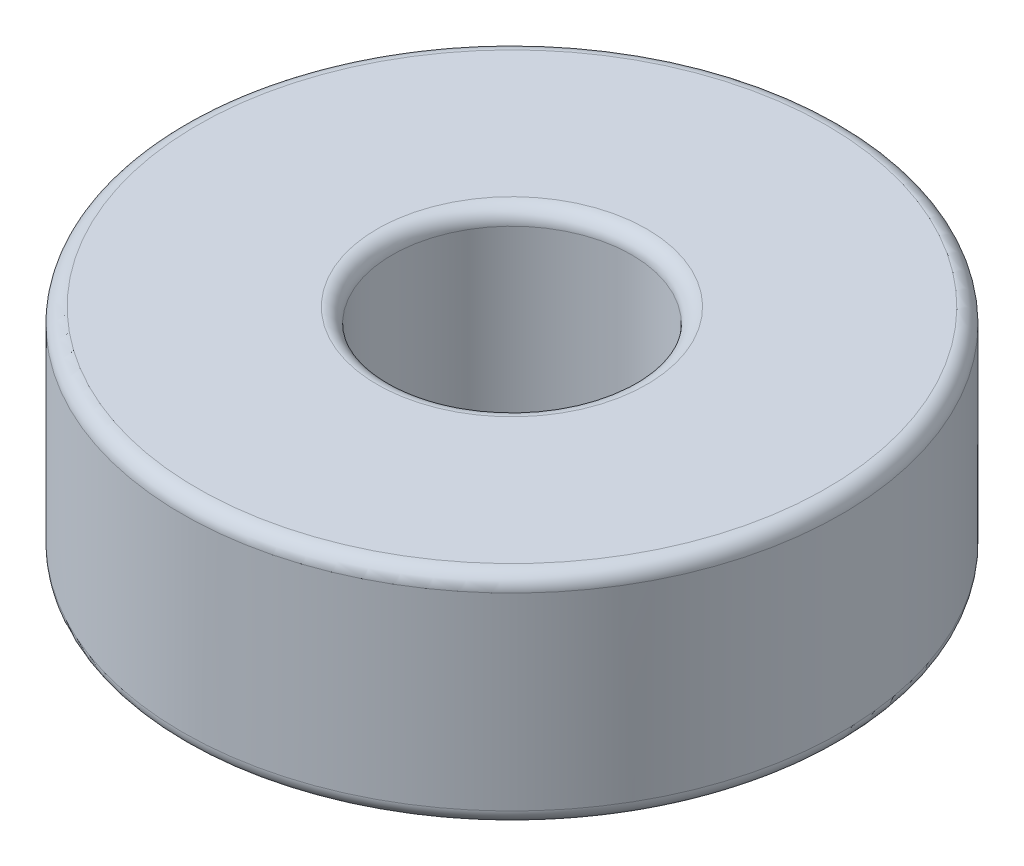
ISO-10303-21;
HEADER;
FILE_DESCRIPTION(('STEP AP214'),'2;1');
FILE_NAME('part.step','',(''),(''),'','','');
FILE_SCHEMA(('AUTOMOTIVE_DESIGN { 1 0 10303 214 1 1 1 1 }'));
ENDSEC;
DATA;
#1=APPLICATION_CONTEXT('core data for automotive mechanical design processes');
#2=APPLICATION_PROTOCOL_DEFINITION('international standard','automotive_design',2000,#1);
#3=PRODUCT_CONTEXT('',#1,'mechanical');
#4=PRODUCT('Part','Part','',(#3));
#5=PRODUCT_RELATED_PRODUCT_CATEGORY('part','',(#4));
#6=PRODUCT_DEFINITION_FORMATION('','',#4);
#7=PRODUCT_DEFINITION_CONTEXT('part definition',#1,'design');
#8=PRODUCT_DEFINITION('design','',#6,#7);
#9=PRODUCT_DEFINITION_SHAPE('','',#8);
#10=(LENGTH_UNIT() NAMED_UNIT(*) SI_UNIT(.MILLI.,.METRE.));
#11=(NAMED_UNIT(*) PLANE_ANGLE_UNIT() SI_UNIT($,.RADIAN.));
#12=(NAMED_UNIT(*) SI_UNIT($,.STERADIAN.) SOLID_ANGLE_UNIT());
#13=UNCERTAINTY_MEASURE_WITH_UNIT(LENGTH_MEASURE(1.E-05),#10,'distance_accuracy_value','');
#14=(GEOMETRIC_REPRESENTATION_CONTEXT(3) GLOBAL_UNCERTAINTY_ASSIGNED_CONTEXT((#13)) GLOBAL_UNIT_ASSIGNED_CONTEXT((#10,
#11,#12)) REPRESENTATION_CONTEXT('',''));
#15=CARTESIAN_POINT('',(0.,0.,0.));
#16=DIRECTION('',(0.,0.,1.));
#17=DIRECTION('',(1.,0.,0.));
#18=AXIS2_PLACEMENT_3D('',#15,#16,#17);
#19=CARTESIAN_POINT('',(0.,0.,0.));
#20=DIRECTION('',(0.,-1.,0.));
#21=DIRECTION('',(0.,0.,-1.));
#22=AXIS2_PLACEMENT_3D('',#19,#20,#21);
#23=CYLINDRICAL_SURFACE('',#22,4.);
#24=CARTESIAN_POINT('',(0.,0.499999999999999,0.));
#25=DIRECTION('',(0.,1.,0.));
#26=DIRECTION('',(0.,0.,1.));
#27=AXIS2_PLACEMENT_3D('',#24,#25,#26);
#28=CIRCLE('',#27,4.);
#29=CARTESIAN_POINT('',(0.,0.499999999999999,4.));
#30=VERTEX_POINT('',#29);
#31=EDGE_CURVE('E57',#30,#30,#28,.F.);
#32=ORIENTED_EDGE('',*,*,#31,.T.);
#33=EDGE_LOOP('',(#32));
#34=FACE_BOUND('',#33,.T.);
#35=CARTESIAN_POINT('',(0.,6.8,0.));
#36=DIRECTION('',(0.,-1.,0.));
#37=DIRECTION('',(0.,0.,-1.));
#38=AXIS2_PLACEMENT_3D('',#35,#36,#37);
#39=CIRCLE('',#38,4.);
#40=CARTESIAN_POINT('',(0.,6.8,-4.));
#41=VERTEX_POINT('',#40);
#42=EDGE_CURVE('E60',#41,#41,#39,.F.);
#43=ORIENTED_EDGE('',*,*,#42,.T.);
#44=EDGE_LOOP('',(#43));
#45=FACE_BOUND('',#44,.T.);
#46=ADVANCED_FACE('F31',(#34,#45),#23,.F.);
#47=CARTESIAN_POINT('',(-4.,7.3,0.));
#48=DIRECTION('',(0.,-1.,0.));
#49=DIRECTION('',(0.,0.,-1.));
#50=AXIS2_PLACEMENT_3D('',#47,#48,#49);
#51=PLANE('',#50);
#52=CARTESIAN_POINT('',(0.,7.3,0.));
#53=DIRECTION('',(0.,-1.,0.));
#54=DIRECTION('',(0.,0.,-1.));
#55=AXIS2_PLACEMENT_3D('',#52,#53,#54);
#56=CIRCLE('',#55,4.5);
#57=CARTESIAN_POINT('',(0.,7.3,-4.5));
#58=VERTEX_POINT('',#57);
#59=EDGE_CURVE('E10',#58,#58,#56,.T.);
#60=ORIENTED_EDGE('',*,*,#59,.T.);
#61=EDGE_LOOP('',(#60));
#62=FACE_BOUND('',#61,.T.);
#63=CARTESIAN_POINT('',(0.,7.3,0.));
#64=DIRECTION('',(0.,-1.,0.));
#65=DIRECTION('',(0.,0.,-1.));
#66=AXIS2_PLACEMENT_3D('',#63,#64,#65);
#67=CIRCLE('',#66,10.5);
#68=CARTESIAN_POINT('',(0.,7.3,-10.5));
#69=VERTEX_POINT('',#68);
#70=EDGE_CURVE('E38',#69,#69,#67,.F.);
#71=ORIENTED_EDGE('',*,*,#70,.T.);
#72=EDGE_LOOP('',(#71));
#73=FACE_BOUND('',#72,.T.);
#74=ADVANCED_FACE('F78',(#62,#73),#51,.F.);
#75=CARTESIAN_POINT('',(0.,0.,0.));
#76=DIRECTION('',(0.,-1.,0.));
#77=DIRECTION('',(0.,0.,-1.));
#78=AXIS2_PLACEMENT_3D('',#75,#76,#77);
#79=CYLINDRICAL_SURFACE('',#78,11.);
#80=CARTESIAN_POINT('',(0.,0.499999999999999,0.));
#81=DIRECTION('',(0.,1.,0.));
#82=DIRECTION('',(0.,0.,1.));
#83=AXIS2_PLACEMENT_3D('',#80,#81,#82);
#84=CIRCLE('',#83,11.);
#85=CARTESIAN_POINT('',(0.,0.499999999999999,11.));
#86=VERTEX_POINT('',#85);
#87=EDGE_CURVE('E42',#86,#86,#84,.T.);
#88=ORIENTED_EDGE('',*,*,#87,.T.);
#89=EDGE_LOOP('',(#88));
#90=FACE_BOUND('',#89,.T.);
#91=CARTESIAN_POINT('',(0.,6.8,0.));
#92=DIRECTION('',(0.,-1.,0.));
#93=DIRECTION('',(0.,0.,-1.));
#94=AXIS2_PLACEMENT_3D('',#91,#92,#93);
#95=CIRCLE('',#94,11.);
#96=CARTESIAN_POINT('',(0.,6.8,-11.));
#97=VERTEX_POINT('',#96);
#98=EDGE_CURVE('E46',#97,#97,#95,.T.);
#99=ORIENTED_EDGE('',*,*,#98,.T.);
#100=EDGE_LOOP('',(#99));
#101=FACE_BOUND('',#100,.T.);
#102=ADVANCED_FACE('F84',(#90,#101),#79,.T.);
#103=CARTESIAN_POINT('',(-4.,0.,0.));
#104=DIRECTION('',(0.,1.,0.));
#105=DIRECTION('',(0.,0.,1.));
#106=AXIS2_PLACEMENT_3D('',#103,#104,#105);
#107=PLANE('',#106);
#108=CARTESIAN_POINT('',(0.,0.,0.));
#109=DIRECTION('',(0.,1.,0.));
#110=DIRECTION('',(0.,0.,1.));
#111=AXIS2_PLACEMENT_3D('',#108,#109,#110);
#112=CIRCLE('',#111,4.5);
#113=CARTESIAN_POINT('',(0.,0.,4.5));
#114=VERTEX_POINT('',#113);
#115=EDGE_CURVE('E51',#114,#114,#112,.T.);
#116=ORIENTED_EDGE('',*,*,#115,.T.);
#117=EDGE_LOOP('',(#116));
#118=FACE_BOUND('',#117,.T.);
#119=CARTESIAN_POINT('',(0.,0.,0.));
#120=DIRECTION('',(0.,1.,0.));
#121=DIRECTION('',(0.,0.,1.));
#122=AXIS2_PLACEMENT_3D('',#119,#120,#121);
#123=CIRCLE('',#122,10.5);
#124=CARTESIAN_POINT('',(0.,0.,10.5));
#125=VERTEX_POINT('',#124);
#126=EDGE_CURVE('E54',#125,#125,#123,.F.);
#127=ORIENTED_EDGE('',*,*,#126,.T.);
#128=EDGE_LOOP('',(#127));
#129=FACE_BOUND('',#128,.T.);
#130=ADVANCED_FACE('F89',(#118,#129),#107,.F.);
#131=CARTESIAN_POINT('',(0.,0.499999999999999,0.));
#132=DIRECTION('',(0.,1.,0.));
#133=DIRECTION('',(0.,0.,1.));
#134=AXIS2_PLACEMENT_3D('',#131,#132,#133);
#135=TOROIDAL_SURFACE('',#134,4.5,0.5);
#136=ORIENTED_EDGE('',*,*,#115,.F.);
#137=EDGE_LOOP('',(#136));
#138=FACE_BOUND('',#137,.T.);
#139=ORIENTED_EDGE('',*,*,#31,.F.);
#140=EDGE_LOOP('',(#139));
#141=FACE_BOUND('',#140,.T.);
#142=ADVANCED_FACE('F74',(#138,#141),#135,.T.);
#143=CARTESIAN_POINT('',(0.,0.499999999999999,0.));
#144=DIRECTION('',(0.,1.,0.));
#145=DIRECTION('',(0.,0.,1.));
#146=AXIS2_PLACEMENT_3D('',#143,#144,#145);
#147=TOROIDAL_SURFACE('',#146,10.5,0.5);
#148=ORIENTED_EDGE('',*,*,#87,.F.);
#149=EDGE_LOOP('',(#148));
#150=FACE_BOUND('',#149,.T.);
#151=ORIENTED_EDGE('',*,*,#126,.F.);
#152=EDGE_LOOP('',(#151));
#153=FACE_BOUND('',#152,.T.);
#154=ADVANCED_FACE('F68',(#150,#153),#147,.T.);
#155=CARTESIAN_POINT('',(0.,6.8,0.));
#156=DIRECTION('',(0.,-1.,0.));
#157=DIRECTION('',(0.,0.,-1.));
#158=AXIS2_PLACEMENT_3D('',#155,#156,#157);
#159=TOROIDAL_SURFACE('',#158,4.5,0.5);
#160=ORIENTED_EDGE('',*,*,#42,.F.);
#161=EDGE_LOOP('',(#160));
#162=FACE_BOUND('',#161,.T.);
#163=ORIENTED_EDGE('',*,*,#59,.F.);
#164=EDGE_LOOP('',(#163));
#165=FACE_BOUND('',#164,.T.);
#166=ADVANCED_FACE('F65',(#162,#165),#159,.T.);
#167=CARTESIAN_POINT('',(0.,6.8,0.));
#168=DIRECTION('',(0.,-1.,0.));
#169=DIRECTION('',(0.,0.,-1.));
#170=AXIS2_PLACEMENT_3D('',#167,#168,#169);
#171=TOROIDAL_SURFACE('',#170,10.5,0.5);
#172=ORIENTED_EDGE('',*,*,#70,.F.);
#173=EDGE_LOOP('',(#172));
#174=FACE_BOUND('',#173,.T.);
#175=ORIENTED_EDGE('',*,*,#98,.F.);
#176=EDGE_LOOP('',(#175));
#177=FACE_BOUND('',#176,.T.);
#178=ADVANCED_FACE('F33',(#174,#177),#171,.T.);
#179=CLOSED_SHELL('',(#46,#74,#102,#130,#142,#154,#166,#178));
#180=MANIFOLD_SOLID_BREP('B2',#179);
#181=ADVANCED_BREP_SHAPE_REPRESENTATION('',(#18,#180),#14);
#182=SHAPE_DEFINITION_REPRESENTATION(#9,#181);
ENDSEC;
END-ISO-10303-21;
